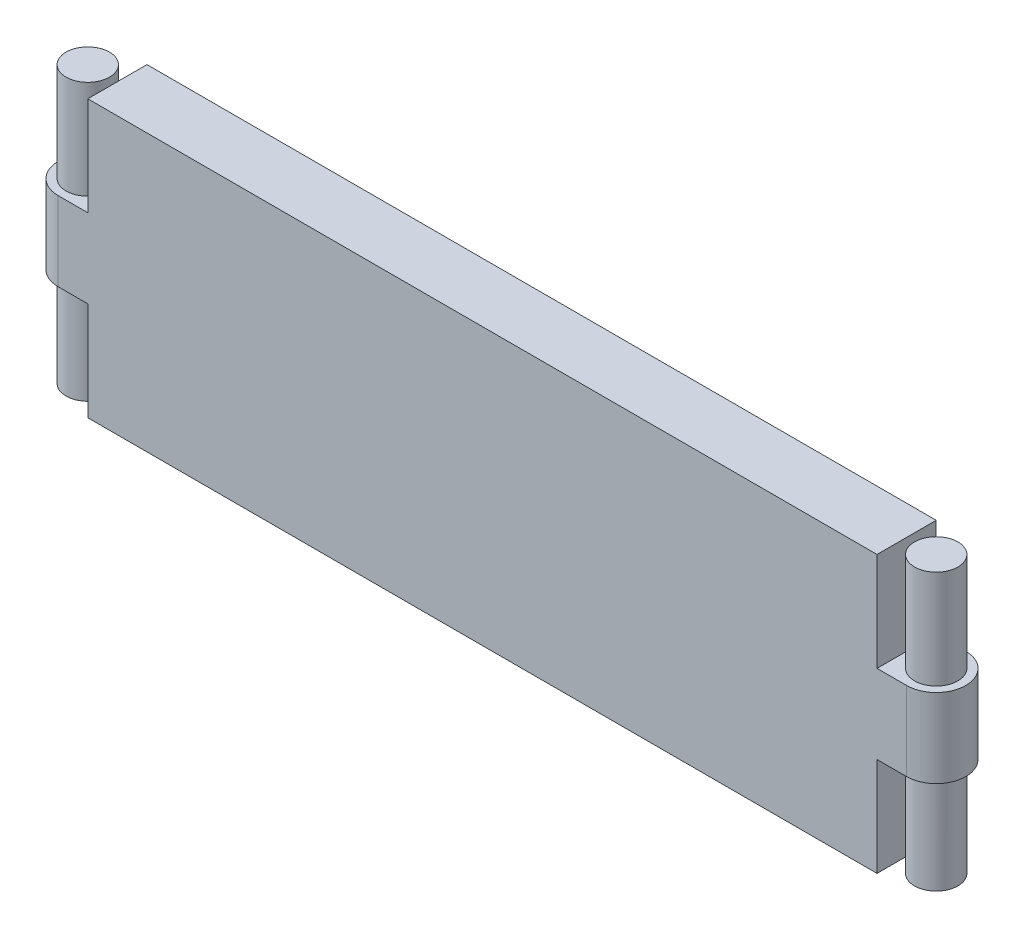
ISO-10303-21;
HEADER;
FILE_DESCRIPTION(('STEP AP214'),'2;1');
FILE_NAME('part.step','',(''),(''),'','','');
FILE_SCHEMA(('AUTOMOTIVE_DESIGN { 1 0 10303 214 1 1 1 1 }'));
ENDSEC;
DATA;
#1=APPLICATION_CONTEXT('core data for automotive mechanical design processes');
#2=APPLICATION_PROTOCOL_DEFINITION('international standard','automotive_design',2000,#1);
#3=PRODUCT_CONTEXT('',#1,'mechanical');
#4=PRODUCT('Part','Part','',(#3));
#5=PRODUCT_RELATED_PRODUCT_CATEGORY('part','',(#4));
#6=PRODUCT_DEFINITION_FORMATION('','',#4);
#7=PRODUCT_DEFINITION_CONTEXT('part definition',#1,'design');
#8=PRODUCT_DEFINITION('design','',#6,#7);
#9=PRODUCT_DEFINITION_SHAPE('','',#8);
#10=(LENGTH_UNIT() NAMED_UNIT(*) SI_UNIT(.MILLI.,.METRE.));
#11=(NAMED_UNIT(*) PLANE_ANGLE_UNIT() SI_UNIT($,.RADIAN.));
#12=(NAMED_UNIT(*) SI_UNIT($,.STERADIAN.) SOLID_ANGLE_UNIT());
#13=UNCERTAINTY_MEASURE_WITH_UNIT(LENGTH_MEASURE(1.E-05),#10,'distance_accuracy_value','');
#14=(GEOMETRIC_REPRESENTATION_CONTEXT(3) GLOBAL_UNCERTAINTY_ASSIGNED_CONTEXT((#13)) GLOBAL_UNIT_ASSIGNED_CONTEXT((#10,
#11,#12)) REPRESENTATION_CONTEXT('',''));
#15=CARTESIAN_POINT('',(0.,0.,0.));
#16=DIRECTION('',(0.,0.,1.));
#17=DIRECTION('',(1.,0.,0.));
#18=AXIS2_PLACEMENT_3D('',#15,#16,#17);
#19=CARTESIAN_POINT('',(-100.,35.,-15.));
#20=DIRECTION('',(-1.,0.,0.));
#21=DIRECTION('',(0.,0.,1.));
#22=AXIS2_PLACEMENT_3D('',#19,#20,#21);
#23=PLANE('',#22);
#24=DIRECTION('',(0.,-1.,0.));
#25=VECTOR('',#24,1.);
#26=CARTESIAN_POINT('',(-100.,35.,-15.));
#27=LINE('',#26,#25);
#28=CARTESIAN_POINT('',(-100.,35.,-15.));
#29=VERTEX_POINT('',#28);
#30=CARTESIAN_POINT('',(-100.,10.,-15.));
#31=VERTEX_POINT('',#30);
#32=EDGE_CURVE('E56',#29,#31,#27,.T.);
#33=ORIENTED_EDGE('',*,*,#32,.T.);
#34=DIRECTION('',(0.,0.,1.));
#35=VECTOR('',#34,1.);
#36=CARTESIAN_POINT('',(-100.,10.,0.));
#37=LINE('',#36,#35);
#38=CARTESIAN_POINT('',(-100.,10.,0.));
#39=VERTEX_POINT('',#38);
#40=EDGE_CURVE('E142',#31,#39,#37,.T.);
#41=ORIENTED_EDGE('',*,*,#40,.T.);
#42=DIRECTION('',(0.,-1.,0.));
#43=VECTOR('',#42,1.);
#44=CARTESIAN_POINT('',(-100.,35.,0.));
#45=LINE('',#44,#43);
#46=CARTESIAN_POINT('',(-100.,35.,0.));
#47=VERTEX_POINT('',#46);
#48=EDGE_CURVE('E217',#47,#39,#45,.T.);
#49=ORIENTED_EDGE('',*,*,#48,.F.);
#50=DIRECTION('',(0.,0.,1.));
#51=VECTOR('',#50,1.);
#52=CARTESIAN_POINT('',(-100.,35.,-15.));
#53=LINE('',#52,#51);
#54=EDGE_CURVE('E227',#29,#47,#53,.T.);
#55=ORIENTED_EDGE('',*,*,#54,.F.);
#56=EDGE_LOOP('',(#33,#41,#49,#55));
#57=FACE_BOUND('',#56,.T.);
#58=ADVANCED_FACE('F33',(#57),#23,.T.);
#59=CARTESIAN_POINT('',(100.,35.,-15.));
#60=DIRECTION('',(1.,0.,0.));
#61=DIRECTION('',(0.,1.,0.));
#62=AXIS2_PLACEMENT_3D('',#59,#60,#61);
#63=PLANE('',#62);
#64=DIRECTION('',(0.,1.,0.));
#65=VECTOR('',#64,1.);
#66=CARTESIAN_POINT('',(100.,35.,-15.));
#67=LINE('',#66,#65);
#68=CARTESIAN_POINT('',(100.,-35.,-15.));
#69=VERTEX_POINT('',#68);
#70=CARTESIAN_POINT('',(100.,-10.,-15.));
#71=VERTEX_POINT('',#70);
#72=EDGE_CURVE('E197',#69,#71,#67,.T.);
#73=ORIENTED_EDGE('',*,*,#72,.T.);
#74=DIRECTION('',(0.,0.,1.));
#75=VECTOR('',#74,1.);
#76=CARTESIAN_POINT('',(100.,-10.,0.));
#77=LINE('',#76,#75);
#78=CARTESIAN_POINT('',(100.,-10.,0.));
#79=VERTEX_POINT('',#78);
#80=EDGE_CURVE('E180',#71,#79,#77,.T.);
#81=ORIENTED_EDGE('',*,*,#80,.T.);
#82=DIRECTION('',(0.,1.,0.));
#83=VECTOR('',#82,1.);
#84=CARTESIAN_POINT('',(100.,35.,0.));
#85=LINE('',#84,#83);
#86=CARTESIAN_POINT('',(100.,-35.,0.));
#87=VERTEX_POINT('',#86);
#88=EDGE_CURVE('E210',#87,#79,#85,.T.);
#89=ORIENTED_EDGE('',*,*,#88,.F.);
#90=DIRECTION('',(0.,0.,1.));
#91=VECTOR('',#90,1.);
#92=CARTESIAN_POINT('',(100.,-35.,-15.));
#93=LINE('',#92,#91);
#94=EDGE_CURVE('E41',#69,#87,#93,.T.);
#95=ORIENTED_EDGE('',*,*,#94,.F.);
#96=EDGE_LOOP('',(#73,#81,#89,#95));
#97=FACE_BOUND('',#96,.T.);
#98=ADVANCED_FACE('F253',(#97),#63,.T.);
#99=DIRECTION('',(0.,0.,1.));
#100=VECTOR('',#99,1.);
#101=CARTESIAN_POINT('',(100.,10.,0.));
#102=LINE('',#101,#100);
#103=CARTESIAN_POINT('',(100.,10.,-15.));
#104=VERTEX_POINT('',#103);
#105=CARTESIAN_POINT('',(100.,10.,0.));
#106=VERTEX_POINT('',#105);
#107=EDGE_CURVE('E169',#104,#106,#102,.T.);
#108=ORIENTED_EDGE('',*,*,#107,.F.);
#109=CARTESIAN_POINT('',(100.,35.,-15.));
#110=VERTEX_POINT('',#109);
#111=EDGE_CURVE('E201',#104,#110,#67,.T.);
#112=ORIENTED_EDGE('',*,*,#111,.T.);
#113=DIRECTION('',(0.,0.,1.));
#114=VECTOR('',#113,1.);
#115=CARTESIAN_POINT('',(100.,35.,-15.));
#116=LINE('',#115,#114);
#117=CARTESIAN_POINT('',(100.,35.,0.));
#118=VERTEX_POINT('',#117);
#119=EDGE_CURVE('E209',#110,#118,#116,.T.);
#120=ORIENTED_EDGE('',*,*,#119,.T.);
#121=EDGE_CURVE('E195',#106,#118,#85,.T.);
#122=ORIENTED_EDGE('',*,*,#121,.F.);
#123=EDGE_LOOP('',(#108,#112,#120,#122));
#124=FACE_BOUND('',#123,.T.);
#125=ADVANCED_FACE('F35',(#124),#63,.T.);
#126=CARTESIAN_POINT('',(-100.,-35.,-15.));
#127=DIRECTION('',(0.,-1.,0.));
#128=DIRECTION('',(0.,0.,-1.));
#129=AXIS2_PLACEMENT_3D('',#126,#127,#128);
#130=PLANE('',#129);
#131=DIRECTION('',(1.,0.,0.));
#132=VECTOR('',#131,1.);
#133=CARTESIAN_POINT('',(-100.,-35.,0.));
#134=LINE('',#133,#132);
#135=CARTESIAN_POINT('',(-100.,-35.,0.));
#136=VERTEX_POINT('',#135);
#137=EDGE_CURVE('E220',#136,#87,#134,.T.);
#138=ORIENTED_EDGE('',*,*,#137,.F.);
#139=DIRECTION('',(0.,0.,1.));
#140=VECTOR('',#139,1.);
#141=CARTESIAN_POINT('',(-100.,-35.,-15.));
#142=LINE('',#141,#140);
#143=CARTESIAN_POINT('',(-100.,-35.,-15.));
#144=VERTEX_POINT('',#143);
#145=EDGE_CURVE('E224',#144,#136,#142,.T.);
#146=ORIENTED_EDGE('',*,*,#145,.F.);
#147=DIRECTION('',(1.,0.,0.));
#148=VECTOR('',#147,1.);
#149=CARTESIAN_POINT('',(-100.,-35.,-15.));
#150=LINE('',#149,#148);
#151=EDGE_CURVE('E206',#144,#69,#150,.T.);
#152=ORIENTED_EDGE('',*,*,#151,.T.);
#153=ORIENTED_EDGE('',*,*,#94,.T.);
#154=EDGE_LOOP('',(#138,#146,#152,#153));
#155=FACE_BOUND('',#154,.T.);
#156=ADVANCED_FACE('F258',(#155),#130,.T.);
#157=DIRECTION('',(0.,0.,1.));
#158=VECTOR('',#157,1.);
#159=CARTESIAN_POINT('',(-100.,-10.,0.));
#160=LINE('',#159,#158);
#161=CARTESIAN_POINT('',(-100.,-10.,-15.));
#162=VERTEX_POINT('',#161);
#163=CARTESIAN_POINT('',(-100.,-10.,0.));
#164=VERTEX_POINT('',#163);
#165=EDGE_CURVE('E48',#162,#164,#160,.T.);
#166=ORIENTED_EDGE('',*,*,#165,.F.);
#167=EDGE_CURVE('E204',#162,#144,#27,.T.);
#168=ORIENTED_EDGE('',*,*,#167,.T.);
#169=ORIENTED_EDGE('',*,*,#145,.T.);
#170=EDGE_CURVE('E216',#164,#136,#45,.T.);
#171=ORIENTED_EDGE('',*,*,#170,.F.);
#172=EDGE_LOOP('',(#166,#168,#169,#171));
#173=FACE_BOUND('',#172,.T.);
#174=ADVANCED_FACE('F277',(#173),#23,.T.);
#175=CARTESIAN_POINT('',(-100.,35.,-15.));
#176=DIRECTION('',(0.,1.,0.));
#177=DIRECTION('',(0.,0.,1.));
#178=AXIS2_PLACEMENT_3D('',#175,#176,#177);
#179=PLANE('',#178);
#180=DIRECTION('',(-1.,0.,0.));
#181=VECTOR('',#180,1.);
#182=CARTESIAN_POINT('',(-100.,35.,0.));
#183=LINE('',#182,#181);
#184=EDGE_CURVE('E213',#118,#47,#183,.T.);
#185=ORIENTED_EDGE('',*,*,#184,.F.);
#186=ORIENTED_EDGE('',*,*,#119,.F.);
#187=DIRECTION('',(-1.,0.,0.));
#188=VECTOR('',#187,1.);
#189=CARTESIAN_POINT('',(-100.,35.,-15.));
#190=LINE('',#189,#188);
#191=EDGE_CURVE('E200',#110,#29,#190,.T.);
#192=ORIENTED_EDGE('',*,*,#191,.T.);
#193=ORIENTED_EDGE('',*,*,#54,.T.);
#194=EDGE_LOOP('',(#185,#186,#192,#193));
#195=FACE_BOUND('',#194,.T.);
#196=ADVANCED_FACE('F237',(#195),#179,.T.);
#197=CARTESIAN_POINT('',(0.,0.,-15.));
#198=DIRECTION('',(0.,0.,1.));
#199=DIRECTION('',(1.,0.,0.));
#200=AXIS2_PLACEMENT_3D('',#197,#198,#199);
#201=PLANE('',#200);
#202=ORIENTED_EDGE('',*,*,#72,.F.);
#203=ORIENTED_EDGE('',*,*,#151,.F.);
#204=ORIENTED_EDGE('',*,*,#167,.F.);
#205=DIRECTION('',(1.,0.,0.));
#206=VECTOR('',#205,1.);
#207=CARTESIAN_POINT('',(-100.,-10.,-15.));
#208=LINE('',#207,#206);
#209=CARTESIAN_POINT('',(-107.5,-10.,-15.));
#210=VERTEX_POINT('',#209);
#211=EDGE_CURVE('E129',#210,#162,#208,.T.);
#212=ORIENTED_EDGE('',*,*,#211,.F.);
#213=DIRECTION('',(0.,1.,0.));
#214=VECTOR('',#213,1.);
#215=CARTESIAN_POINT('',(-107.5,-10.,-15.));
#216=LINE('',#215,#214);
#217=CARTESIAN_POINT('',(-107.5,10.,-15.));
#218=VERTEX_POINT('',#217);
#219=EDGE_CURVE('E123',#210,#218,#216,.T.);
#220=ORIENTED_EDGE('',*,*,#219,.T.);
#221=DIRECTION('',(1.,0.,0.));
#222=VECTOR('',#221,1.);
#223=CARTESIAN_POINT('',(-100.,10.,-15.));
#224=LINE('',#223,#222);
#225=EDGE_CURVE('E127',#218,#31,#224,.T.);
#226=ORIENTED_EDGE('',*,*,#225,.T.);
#227=ORIENTED_EDGE('',*,*,#32,.F.);
#228=ORIENTED_EDGE('',*,*,#191,.F.);
#229=ORIENTED_EDGE('',*,*,#111,.F.);
#230=DIRECTION('',(-1.,0.,0.));
#231=VECTOR('',#230,1.);
#232=CARTESIAN_POINT('',(100.,10.,-15.));
#233=LINE('',#232,#231);
#234=CARTESIAN_POINT('',(107.5,10.,-15.));
#235=VERTEX_POINT('',#234);
#236=EDGE_CURVE('E178',#235,#104,#233,.T.);
#237=ORIENTED_EDGE('',*,*,#236,.F.);
#238=DIRECTION('',(0.,1.,0.));
#239=VECTOR('',#238,1.);
#240=CARTESIAN_POINT('',(107.5,-10.,-15.));
#241=LINE('',#240,#239);
#242=CARTESIAN_POINT('',(107.5,-10.,-15.));
#243=VERTEX_POINT('',#242);
#244=EDGE_CURVE('E193',#243,#235,#241,.T.);
#245=ORIENTED_EDGE('',*,*,#244,.F.);
#246=DIRECTION('',(-1.,0.,0.));
#247=VECTOR('',#246,1.);
#248=CARTESIAN_POINT('',(100.,-10.,-15.));
#249=LINE('',#248,#247);
#250=EDGE_CURVE('E189',#243,#71,#249,.T.);
#251=ORIENTED_EDGE('',*,*,#250,.T.);
#252=EDGE_LOOP('',(#202,#203,#204,#212,#220,#226,#227,#228,#229,#237,#245,#251));
#253=FACE_BOUND('',#252,.T.);
#254=ADVANCED_FACE('F126',(#253),#201,.F.);
#255=CARTESIAN_POINT('',(0.,0.,0.));
#256=DIRECTION('',(0.,0.,1.));
#257=DIRECTION('',(1.,0.,0.));
#258=AXIS2_PLACEMENT_3D('',#255,#256,#257);
#259=PLANE('',#258);
#260=ORIENTED_EDGE('',*,*,#88,.T.);
#261=DIRECTION('',(1.,0.,0.));
#262=VECTOR('',#261,1.);
#263=CARTESIAN_POINT('',(107.5,-10.,0.));
#264=LINE('',#263,#262);
#265=CARTESIAN_POINT('',(107.5,-10.,0.));
#266=VERTEX_POINT('',#265);
#267=EDGE_CURVE('E183',#79,#266,#264,.T.);
#268=ORIENTED_EDGE('',*,*,#267,.T.);
#269=DIRECTION('',(0.,1.,0.));
#270=VECTOR('',#269,1.);
#271=CARTESIAN_POINT('',(107.5,-10.,0.));
#272=LINE('',#271,#270);
#273=CARTESIAN_POINT('',(107.5,10.,0.));
#274=VERTEX_POINT('',#273);
#275=EDGE_CURVE('E192',#266,#274,#272,.T.);
#276=ORIENTED_EDGE('',*,*,#275,.T.);
#277=DIRECTION('',(1.,0.,0.));
#278=VECTOR('',#277,1.);
#279=CARTESIAN_POINT('',(107.5,10.,0.));
#280=LINE('',#279,#278);
#281=EDGE_CURVE('E172',#106,#274,#280,.T.);
#282=ORIENTED_EDGE('',*,*,#281,.F.);
#283=ORIENTED_EDGE('',*,*,#121,.T.);
#284=ORIENTED_EDGE('',*,*,#184,.T.);
#285=ORIENTED_EDGE('',*,*,#48,.T.);
#286=DIRECTION('',(-1.,0.,0.));
#287=VECTOR('',#286,1.);
#288=CARTESIAN_POINT('',(-107.5,10.,0.));
#289=LINE('',#288,#287);
#290=CARTESIAN_POINT('',(-107.5,10.,0.));
#291=VERTEX_POINT('',#290);
#292=EDGE_CURVE('E146',#39,#291,#289,.T.);
#293=ORIENTED_EDGE('',*,*,#292,.T.);
#294=DIRECTION('',(0.,1.,0.));
#295=VECTOR('',#294,1.);
#296=CARTESIAN_POINT('',(-107.5,-10.,0.));
#297=LINE('',#296,#295);
#298=CARTESIAN_POINT('',(-107.5,-10.,0.));
#299=VERTEX_POINT('',#298);
#300=EDGE_CURVE('E133',#299,#291,#297,.T.);
#301=ORIENTED_EDGE('',*,*,#300,.F.);
#302=DIRECTION('',(-1.,0.,0.));
#303=VECTOR('',#302,1.);
#304=CARTESIAN_POINT('',(-107.5,-10.,0.));
#305=LINE('',#304,#303);
#306=EDGE_CURVE('E134',#164,#299,#305,.T.);
#307=ORIENTED_EDGE('',*,*,#306,.F.);
#308=ORIENTED_EDGE('',*,*,#170,.T.);
#309=ORIENTED_EDGE('',*,*,#137,.T.);
#310=EDGE_LOOP('',(#260,#268,#276,#282,#283,#284,#285,#293,#301,#307,#308,#309));
#311=FACE_BOUND('',#310,.T.);
#312=ADVANCED_FACE('F240',(#311),#259,.T.);
#313=CARTESIAN_POINT('',(107.5,-10.,-7.5));
#314=DIRECTION('',(0.,1.,0.));
#315=DIRECTION('',(0.,0.,1.));
#316=AXIS2_PLACEMENT_3D('',#313,#314,#315);
#317=CYLINDRICAL_SURFACE('',#316,7.5);
#318=ORIENTED_EDGE('',*,*,#244,.T.);
#319=CARTESIAN_POINT('',(107.5,10.,-7.5));
#320=DIRECTION('',(0.,1.,0.));
#321=DIRECTION('',(0.,0.,1.));
#322=AXIS2_PLACEMENT_3D('',#319,#320,#321);
#323=CIRCLE('',#322,7.5);
#324=EDGE_CURVE('E175',#274,#235,#323,.T.);
#325=ORIENTED_EDGE('',*,*,#324,.F.);
#326=ORIENTED_EDGE('',*,*,#275,.F.);
#327=CARTESIAN_POINT('',(107.5,-10.,-7.5));
#328=DIRECTION('',(0.,1.,0.));
#329=DIRECTION('',(0.,0.,1.));
#330=AXIS2_PLACEMENT_3D('',#327,#328,#329);
#331=CIRCLE('',#330,7.5);
#332=EDGE_CURVE('E186',#266,#243,#331,.T.);
#333=ORIENTED_EDGE('',*,*,#332,.T.);
#334=EDGE_LOOP('',(#318,#325,#326,#333));
#335=FACE_BOUND('',#334,.T.);
#336=ADVANCED_FACE('F248',(#335),#317,.T.);
#337=CARTESIAN_POINT('',(107.5,-10.,-7.5));
#338=DIRECTION('',(0.,1.,0.));
#339=DIRECTION('',(0.,0.,1.));
#340=AXIS2_PLACEMENT_3D('',#337,#338,#339);
#341=PLANE('',#340);
#342=CARTESIAN_POINT('',(107.5,-10.,-7.5));
#343=DIRECTION('',(0.,1.,0.));
#344=DIRECTION('',(0.,0.,1.));
#345=AXIS2_PLACEMENT_3D('',#342,#343,#344);
#346=CIRCLE('',#345,5.5);
#347=CARTESIAN_POINT('',(107.5,-10.,-2.));
#348=VERTEX_POINT('',#347);
#349=EDGE_CURVE('E156',#348,#348,#346,.T.);
#350=ORIENTED_EDGE('',*,*,#349,.T.);
#351=EDGE_LOOP('',(#350));
#352=FACE_BOUND('',#351,.T.);
#353=ORIENTED_EDGE('',*,*,#80,.F.);
#354=ORIENTED_EDGE('',*,*,#250,.F.);
#355=ORIENTED_EDGE('',*,*,#332,.F.);
#356=ORIENTED_EDGE('',*,*,#267,.F.);
#357=EDGE_LOOP('',(#353,#354,#355,#356));
#358=FACE_BOUND('',#357,.T.);
#359=ADVANCED_FACE('F250',(#352,#358),#341,.F.);
#360=CARTESIAN_POINT('',(107.5,10.,-7.5));
#361=DIRECTION('',(0.,1.,0.));
#362=DIRECTION('',(0.,0.,1.));
#363=AXIS2_PLACEMENT_3D('',#360,#361,#362);
#364=PLANE('',#363);
#365=CARTESIAN_POINT('',(107.5,10.,-7.5));
#366=DIRECTION('',(0.,1.,0.));
#367=DIRECTION('',(0.,0.,1.));
#368=AXIS2_PLACEMENT_3D('',#365,#366,#367);
#369=CIRCLE('',#368,5.5);
#370=CARTESIAN_POINT('',(107.5,10.,-2.));
#371=VERTEX_POINT('',#370);
#372=EDGE_CURVE('E163',#371,#371,#369,.T.);
#373=ORIENTED_EDGE('',*,*,#372,.F.);
#374=EDGE_LOOP('',(#373));
#375=FACE_BOUND('',#374,.T.);
#376=ORIENTED_EDGE('',*,*,#107,.T.);
#377=ORIENTED_EDGE('',*,*,#281,.T.);
#378=ORIENTED_EDGE('',*,*,#324,.T.);
#379=ORIENTED_EDGE('',*,*,#236,.T.);
#380=EDGE_LOOP('',(#376,#377,#378,#379));
#381=FACE_BOUND('',#380,.T.);
#382=ADVANCED_FACE('F243',(#375,#381),#364,.T.);
#383=CARTESIAN_POINT('',(107.5,50.5563491861041,-7.5));
#384=DIRECTION('',(0.,-1.,0.));
#385=DIRECTION('',(0.,0.,-1.));
#386=AXIS2_PLACEMENT_3D('',#383,#384,#385);
#387=CYLINDRICAL_SURFACE('',#386,5.5);
#388=ORIENTED_EDGE('',*,*,#372,.T.);
#389=EDGE_LOOP('',(#388));
#390=FACE_BOUND('',#389,.T.);
#391=CARTESIAN_POINT('',(107.5,35.,-7.5));
#392=DIRECTION('',(0.,1.,0.));
#393=DIRECTION('',(0.,0.,1.));
#394=AXIS2_PLACEMENT_3D('',#391,#392,#393);
#395=CIRCLE('',#394,5.5);
#396=CARTESIAN_POINT('',(107.5,35.,-2.));
#397=VERTEX_POINT('',#396);
#398=EDGE_CURVE('E166',#397,#397,#395,.T.);
#399=ORIENTED_EDGE('',*,*,#398,.F.);
#400=EDGE_LOOP('',(#399));
#401=FACE_BOUND('',#400,.T.);
#402=ADVANCED_FACE('F302',(#390,#401),#387,.T.);
#403=CARTESIAN_POINT('',(-100.,35.,-15.));
#404=DIRECTION('',(0.,1.,0.));
#405=DIRECTION('',(0.,0.,1.));
#406=AXIS2_PLACEMENT_3D('',#403,#404,#405);
#407=PLANE('',#406);
#408=ORIENTED_EDGE('',*,*,#398,.T.);
#409=EDGE_LOOP('',(#408));
#410=FACE_BOUND('',#409,.T.);
#411=ADVANCED_FACE('F304',(#410),#407,.T.);
#412=CARTESIAN_POINT('',(-100.,-35.,-15.));
#413=DIRECTION('',(0.,-1.,0.));
#414=DIRECTION('',(0.,0.,-1.));
#415=AXIS2_PLACEMENT_3D('',#412,#413,#414);
#416=PLANE('',#415);
#417=CARTESIAN_POINT('',(107.5,-35.,-7.5));
#418=DIRECTION('',(0.,-1.,0.));
#419=DIRECTION('',(0.,0.,-1.));
#420=AXIS2_PLACEMENT_3D('',#417,#418,#419);
#421=CIRCLE('',#420,5.5);
#422=CARTESIAN_POINT('',(107.5,-35.,-13.));
#423=VERTEX_POINT('',#422);
#424=EDGE_CURVE('E160',#423,#423,#421,.F.);
#425=ORIENTED_EDGE('',*,*,#424,.F.);
#426=EDGE_LOOP('',(#425));
#427=FACE_BOUND('',#426,.T.);
#428=ADVANCED_FACE('F307',(#427),#416,.T.);
#429=CARTESIAN_POINT('',(107.5,-50.5563491861041,-7.5));
#430=DIRECTION('',(0.,1.,0.));
#431=DIRECTION('',(0.,0.,1.));
#432=AXIS2_PLACEMENT_3D('',#429,#430,#431);
#433=CYLINDRICAL_SURFACE('',#432,5.5);
#434=ORIENTED_EDGE('',*,*,#349,.F.);
#435=EDGE_LOOP('',(#434));
#436=FACE_BOUND('',#435,.T.);
#437=ORIENTED_EDGE('',*,*,#424,.T.);
#438=EDGE_LOOP('',(#437));
#439=FACE_BOUND('',#438,.T.);
#440=ADVANCED_FACE('F272',(#436,#439),#433,.T.);
#441=CARTESIAN_POINT('',(-107.5,-10.,-7.5));
#442=DIRECTION('',(0.,1.,0.));
#443=DIRECTION('',(0.,0.,1.));
#444=AXIS2_PLACEMENT_3D('',#441,#442,#443);
#445=CYLINDRICAL_SURFACE('',#444,7.5);
#446=ORIENTED_EDGE('',*,*,#300,.T.);
#447=CARTESIAN_POINT('',(-107.5,10.,-7.5));
#448=DIRECTION('',(0.,-1.,0.));
#449=DIRECTION('',(0.,0.,1.));
#450=AXIS2_PLACEMENT_3D('',#447,#448,#449);
#451=CIRCLE('',#450,7.5);
#452=EDGE_CURVE('E140',#291,#218,#451,.T.);
#453=ORIENTED_EDGE('',*,*,#452,.T.);
#454=ORIENTED_EDGE('',*,*,#219,.F.);
#455=CARTESIAN_POINT('',(-107.5,-10.,-7.5));
#456=DIRECTION('',(0.,-1.,0.));
#457=DIRECTION('',(0.,0.,1.));
#458=AXIS2_PLACEMENT_3D('',#455,#456,#457);
#459=CIRCLE('',#458,7.5);
#460=EDGE_CURVE('E153',#299,#210,#459,.T.);
#461=ORIENTED_EDGE('',*,*,#460,.F.);
#462=EDGE_LOOP('',(#446,#453,#454,#461));
#463=FACE_BOUND('',#462,.T.);
#464=ADVANCED_FACE('F144',(#463),#445,.T.);
#465=CARTESIAN_POINT('',(-107.5,-10.,-7.5));
#466=DIRECTION('',(0.,1.,0.));
#467=DIRECTION('',(0.,0.,1.));
#468=AXIS2_PLACEMENT_3D('',#465,#466,#467);
#469=PLANE('',#468);
#470=CARTESIAN_POINT('',(-107.5,-10.,-7.5));
#471=DIRECTION('',(0.,1.,0.));
#472=DIRECTION('',(0.,0.,1.));
#473=AXIS2_PLACEMENT_3D('',#470,#471,#472);
#474=CIRCLE('',#473,5.5);
#475=CARTESIAN_POINT('',(-107.5,-10.,-2.));
#476=VERTEX_POINT('',#475);
#477=EDGE_CURVE('E387',#476,#476,#474,.T.);
#478=ORIENTED_EDGE('',*,*,#477,.T.);
#479=EDGE_LOOP('',(#478));
#480=FACE_BOUND('',#479,.T.);
#481=ORIENTED_EDGE('',*,*,#165,.T.);
#482=ORIENTED_EDGE('',*,*,#306,.T.);
#483=ORIENTED_EDGE('',*,*,#460,.T.);
#484=ORIENTED_EDGE('',*,*,#211,.T.);
#485=EDGE_LOOP('',(#481,#482,#483,#484));
#486=FACE_BOUND('',#485,.T.);
#487=ADVANCED_FACE('F261',(#480,#486),#469,.F.);
#488=CARTESIAN_POINT('',(-107.5,10.,-7.5));
#489=DIRECTION('',(0.,1.,0.));
#490=DIRECTION('',(0.,0.,1.));
#491=AXIS2_PLACEMENT_3D('',#488,#489,#490);
#492=PLANE('',#491);
#493=CARTESIAN_POINT('',(-107.5,10.,-7.5));
#494=DIRECTION('',(0.,1.,0.));
#495=DIRECTION('',(0.,0.,1.));
#496=AXIS2_PLACEMENT_3D('',#493,#494,#495);
#497=CIRCLE('',#496,5.5);
#498=CARTESIAN_POINT('',(-107.5,10.,-2.));
#499=VERTEX_POINT('',#498);
#500=EDGE_CURVE('E11',#499,#499,#497,.T.);
#501=ORIENTED_EDGE('',*,*,#500,.F.);
#502=EDGE_LOOP('',(#501));
#503=FACE_BOUND('',#502,.T.);
#504=ORIENTED_EDGE('',*,*,#40,.F.);
#505=ORIENTED_EDGE('',*,*,#225,.F.);
#506=ORIENTED_EDGE('',*,*,#452,.F.);
#507=ORIENTED_EDGE('',*,*,#292,.F.);
#508=EDGE_LOOP('',(#504,#505,#506,#507));
#509=FACE_BOUND('',#508,.T.);
#510=ADVANCED_FACE('F138',(#503,#509),#492,.T.);
#511=CARTESIAN_POINT('',(-100.,35.,-15.));
#512=DIRECTION('',(0.,1.,0.));
#513=DIRECTION('',(0.,0.,1.));
#514=AXIS2_PLACEMENT_3D('',#511,#512,#513);
#515=PLANE('',#514);
#516=CARTESIAN_POINT('',(-107.5,35.,-7.5));
#517=DIRECTION('',(0.,1.,0.));
#518=DIRECTION('',(0.,0.,1.));
#519=AXIS2_PLACEMENT_3D('',#516,#517,#518);
#520=CIRCLE('',#519,5.5);
#521=CARTESIAN_POINT('',(-107.5,35.,-2.));
#522=VERTEX_POINT('',#521);
#523=EDGE_CURVE('E391',#522,#522,#520,.F.);
#524=ORIENTED_EDGE('',*,*,#523,.F.);
#525=EDGE_LOOP('',(#524));
#526=FACE_BOUND('',#525,.T.);
#527=ADVANCED_FACE('F269',(#526),#515,.T.);
#528=CARTESIAN_POINT('',(-107.5,50.5563491861041,-7.5));
#529=DIRECTION('',(0.,-1.,0.));
#530=DIRECTION('',(0.,0.,-1.));
#531=AXIS2_PLACEMENT_3D('',#528,#529,#530);
#532=CYLINDRICAL_SURFACE('',#531,5.5);
#533=ORIENTED_EDGE('',*,*,#500,.T.);
#534=EDGE_LOOP('',(#533));
#535=FACE_BOUND('',#534,.T.);
#536=ORIENTED_EDGE('',*,*,#523,.T.);
#537=EDGE_LOOP('',(#536));
#538=FACE_BOUND('',#537,.T.);
#539=ADVANCED_FACE('F351',(#535,#538),#532,.T.);
#540=CARTESIAN_POINT('',(-100.,-35.,-15.));
#541=DIRECTION('',(0.,-1.,0.));
#542=DIRECTION('',(0.,0.,-1.));
#543=AXIS2_PLACEMENT_3D('',#540,#541,#542);
#544=PLANE('',#543);
#545=CARTESIAN_POINT('',(-107.5,-35.,-7.5));
#546=DIRECTION('',(0.,-1.,0.));
#547=DIRECTION('',(0.,0.,-1.));
#548=AXIS2_PLACEMENT_3D('',#545,#546,#547);
#549=CIRCLE('',#548,5.5);
#550=CARTESIAN_POINT('',(-107.5,-35.,-13.));
#551=VERTEX_POINT('',#550);
#552=EDGE_CURVE('E390',#551,#551,#549,.F.);
#553=ORIENTED_EDGE('',*,*,#552,.F.);
#554=EDGE_LOOP('',(#553));
#555=FACE_BOUND('',#554,.T.);
#556=ADVANCED_FACE('F361',(#555),#544,.T.);
#557=CARTESIAN_POINT('',(-107.5,-50.5563491861041,-7.5));
#558=DIRECTION('',(0.,1.,0.));
#559=DIRECTION('',(0.,0.,1.));
#560=AXIS2_PLACEMENT_3D('',#557,#558,#559);
#561=CYLINDRICAL_SURFACE('',#560,5.5);
#562=ORIENTED_EDGE('',*,*,#477,.F.);
#563=EDGE_LOOP('',(#562));
#564=FACE_BOUND('',#563,.T.);
#565=ORIENTED_EDGE('',*,*,#552,.T.);
#566=EDGE_LOOP('',(#565));
#567=FACE_BOUND('',#566,.T.);
#568=ADVANCED_FACE('F371',(#564,#567),#561,.T.);
#569=CLOSED_SHELL('',(#58,#98,#125,#156,#174,#196,#254,#312,#336,#359,#382,#402,#411,#428,#440,
#464,#487,#510,#527,#539,#556,#568));
#570=MANIFOLD_SOLID_BREP('B2',#569);
#571=ADVANCED_BREP_SHAPE_REPRESENTATION('',(#18,#570),#14);
#572=SHAPE_DEFINITION_REPRESENTATION(#9,#571);
ENDSEC;
END-ISO-10303-21;
